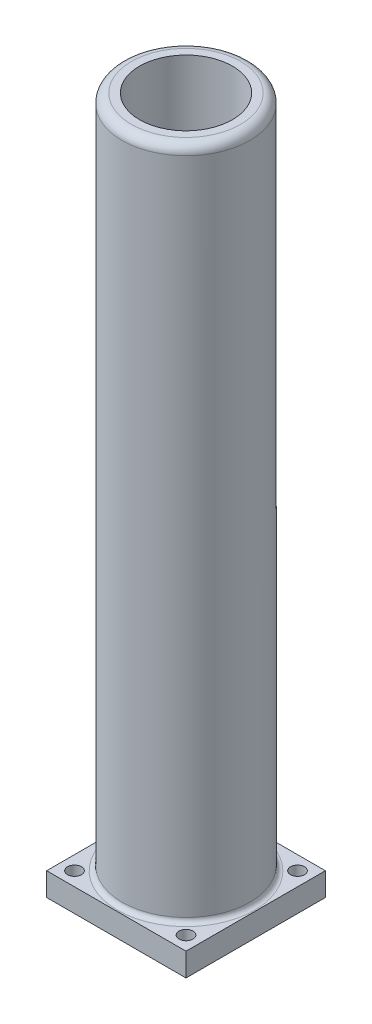
ISO-10303-21;
HEADER;
FILE_DESCRIPTION(('STEP AP214'),'2;1');
FILE_NAME('part.step','',(''),(''),'','','');
FILE_SCHEMA(('AUTOMOTIVE_DESIGN { 1 0 10303 214 1 1 1 1 }'));
ENDSEC;
DATA;
#1=APPLICATION_CONTEXT('core data for automotive mechanical design processes');
#2=APPLICATION_PROTOCOL_DEFINITION('international standard','automotive_design',2000,#1);
#3=PRODUCT_CONTEXT('',#1,'mechanical');
#4=PRODUCT('Part','Part','',(#3));
#5=PRODUCT_RELATED_PRODUCT_CATEGORY('part','',(#4));
#6=PRODUCT_DEFINITION_FORMATION('','',#4);
#7=PRODUCT_DEFINITION_CONTEXT('part definition',#1,'design');
#8=PRODUCT_DEFINITION('design','',#6,#7);
#9=PRODUCT_DEFINITION_SHAPE('','',#8);
#10=(LENGTH_UNIT() NAMED_UNIT(*) SI_UNIT(.MILLI.,.METRE.));
#11=(NAMED_UNIT(*) PLANE_ANGLE_UNIT() SI_UNIT($,.RADIAN.));
#12=(NAMED_UNIT(*) SI_UNIT($,.STERADIAN.) SOLID_ANGLE_UNIT());
#13=UNCERTAINTY_MEASURE_WITH_UNIT(LENGTH_MEASURE(1.E-05),#10,'distance_accuracy_value','');
#14=(GEOMETRIC_REPRESENTATION_CONTEXT(3) GLOBAL_UNCERTAINTY_ASSIGNED_CONTEXT((#13)) GLOBAL_UNIT_ASSIGNED_CONTEXT((#10,
#11,#12)) REPRESENTATION_CONTEXT('',''));
#15=CARTESIAN_POINT('',(0.,0.,0.));
#16=DIRECTION('',(0.,0.,1.));
#17=DIRECTION('',(1.,0.,0.));
#18=AXIS2_PLACEMENT_3D('',#15,#16,#17);
#19=CARTESIAN_POINT('',(30.,300.,30.));
#20=DIRECTION('',(-1.,0.,0.));
#21=DIRECTION('',(0.,0.,1.));
#22=AXIS2_PLACEMENT_3D('',#19,#20,#21);
#23=PLANE('',#22);
#24=DIRECTION('',(0.,0.,-1.));
#25=VECTOR('',#24,1.);
#26=CARTESIAN_POINT('',(30.,10.,30.));
#27=LINE('',#26,#25);
#28=CARTESIAN_POINT('',(30.,10.,30.));
#29=VERTEX_POINT('',#28);
#30=CARTESIAN_POINT('',(30.,10.,-30.));
#31=VERTEX_POINT('',#30);
#32=EDGE_CURVE('E81',#29,#31,#27,.T.);
#33=ORIENTED_EDGE('',*,*,#32,.F.);
#34=DIRECTION('',(0.,-1.,0.));
#35=VECTOR('',#34,1.);
#36=CARTESIAN_POINT('',(30.,300.,30.));
#37=LINE('',#36,#35);
#38=CARTESIAN_POINT('',(30.,0.,30.));
#39=VERTEX_POINT('',#38);
#40=EDGE_CURVE('E62',#29,#39,#37,.T.);
#41=ORIENTED_EDGE('',*,*,#40,.T.);
#42=DIRECTION('',(0.,0.,-1.));
#43=VECTOR('',#42,1.);
#44=CARTESIAN_POINT('',(30.,0.,30.));
#45=LINE('',#44,#43);
#46=CARTESIAN_POINT('',(30.,0.,-30.));
#47=VERTEX_POINT('',#46);
#48=EDGE_CURVE('E89',#39,#47,#45,.T.);
#49=ORIENTED_EDGE('',*,*,#48,.T.);
#50=DIRECTION('',(0.,-1.,0.));
#51=VECTOR('',#50,1.);
#52=CARTESIAN_POINT('',(30.,300.,-30.));
#53=LINE('',#52,#51);
#54=EDGE_CURVE('E86',#31,#47,#53,.T.);
#55=ORIENTED_EDGE('',*,*,#54,.F.);
#56=EDGE_LOOP('',(#33,#41,#49,#55));
#57=FACE_BOUND('',#56,.T.);
#58=ADVANCED_FACE('F39',(#57),#23,.F.);
#59=CARTESIAN_POINT('',(-30.,300.,-30.));
#60=DIRECTION('',(0.,0.,1.));
#61=DIRECTION('',(1.,0.,0.));
#62=AXIS2_PLACEMENT_3D('',#59,#60,#61);
#63=PLANE('',#62);
#64=DIRECTION('',(-1.,0.,0.));
#65=VECTOR('',#64,1.);
#66=CARTESIAN_POINT('',(-30.,10.,-30.));
#67=LINE('',#66,#65);
#68=CARTESIAN_POINT('',(-30.,10.,-30.));
#69=VERTEX_POINT('',#68);
#70=EDGE_CURVE('E90',#31,#69,#67,.T.);
#71=ORIENTED_EDGE('',*,*,#70,.F.);
#72=ORIENTED_EDGE('',*,*,#54,.T.);
#73=DIRECTION('',(-1.,0.,0.));
#74=VECTOR('',#73,1.);
#75=CARTESIAN_POINT('',(-30.,0.,-30.));
#76=LINE('',#75,#74);
#77=CARTESIAN_POINT('',(-30.,0.,-30.));
#78=VERTEX_POINT('',#77);
#79=EDGE_CURVE('E210',#47,#78,#76,.T.);
#80=ORIENTED_EDGE('',*,*,#79,.T.);
#81=DIRECTION('',(0.,-1.,0.));
#82=VECTOR('',#81,1.);
#83=CARTESIAN_POINT('',(-30.,300.,-30.));
#84=LINE('',#83,#82);
#85=EDGE_CURVE('E98',#69,#78,#84,.T.);
#86=ORIENTED_EDGE('',*,*,#85,.F.);
#87=EDGE_LOOP('',(#71,#72,#80,#86));
#88=FACE_BOUND('',#87,.T.);
#89=ADVANCED_FACE('F131',(#88),#63,.F.);
#90=CARTESIAN_POINT('',(-30.,300.,30.));
#91=DIRECTION('',(1.,0.,0.));
#92=DIRECTION('',(0.,0.,-1.));
#93=AXIS2_PLACEMENT_3D('',#90,#91,#92);
#94=PLANE('',#93);
#95=DIRECTION('',(0.,0.,1.));
#96=VECTOR('',#95,1.);
#97=CARTESIAN_POINT('',(-30.,10.,30.));
#98=LINE('',#97,#96);
#99=CARTESIAN_POINT('',(-30.,10.,30.));
#100=VERTEX_POINT('',#99);
#101=EDGE_CURVE('E54',#69,#100,#98,.T.);
#102=ORIENTED_EDGE('',*,*,#101,.F.);
#103=ORIENTED_EDGE('',*,*,#85,.T.);
#104=DIRECTION('',(0.,0.,1.));
#105=VECTOR('',#104,1.);
#106=CARTESIAN_POINT('',(-30.,0.,30.));
#107=LINE('',#106,#105);
#108=CARTESIAN_POINT('',(-30.,0.,30.));
#109=VERTEX_POINT('',#108);
#110=EDGE_CURVE('E100',#78,#109,#107,.T.);
#111=ORIENTED_EDGE('',*,*,#110,.T.);
#112=DIRECTION('',(0.,-1.,0.));
#113=VECTOR('',#112,1.);
#114=CARTESIAN_POINT('',(-30.,300.,30.));
#115=LINE('',#114,#113);
#116=EDGE_CURVE('E96',#100,#109,#115,.T.);
#117=ORIENTED_EDGE('',*,*,#116,.F.);
#118=EDGE_LOOP('',(#102,#103,#111,#117));
#119=FACE_BOUND('',#118,.T.);
#120=ADVANCED_FACE('F136',(#119),#94,.F.);
#121=CARTESIAN_POINT('',(-30.,300.,30.));
#122=DIRECTION('',(0.,0.,-1.));
#123=DIRECTION('',(-1.,0.,0.));
#124=AXIS2_PLACEMENT_3D('',#121,#122,#123);
#125=PLANE('',#124);
#126=DIRECTION('',(1.,0.,0.));
#127=VECTOR('',#126,1.);
#128=CARTESIAN_POINT('',(-30.,10.,30.));
#129=LINE('',#128,#127);
#130=EDGE_CURVE('E79',#100,#29,#129,.T.);
#131=ORIENTED_EDGE('',*,*,#130,.F.);
#132=ORIENTED_EDGE('',*,*,#116,.T.);
#133=DIRECTION('',(1.,0.,0.));
#134=VECTOR('',#133,1.);
#135=CARTESIAN_POINT('',(-30.,0.,30.));
#136=LINE('',#135,#134);
#137=EDGE_CURVE('E94',#109,#39,#136,.T.);
#138=ORIENTED_EDGE('',*,*,#137,.T.);
#139=ORIENTED_EDGE('',*,*,#40,.F.);
#140=EDGE_LOOP('',(#131,#132,#138,#139));
#141=FACE_BOUND('',#140,.T.);
#142=ADVANCED_FACE('F92',(#141),#125,.F.);
#143=CARTESIAN_POINT('',(0.,0.,0.));
#144=DIRECTION('',(0.,-1.,0.));
#145=DIRECTION('',(0.,0.,-1.));
#146=AXIS2_PLACEMENT_3D('',#143,#144,#145);
#147=PLANE('',#146);
#148=CARTESIAN_POINT('',(-24.,0.,24.));
#149=DIRECTION('',(0.,1.,0.));
#150=DIRECTION('',(0.,0.,1.));
#151=AXIS2_PLACEMENT_3D('',#148,#149,#150);
#152=CIRCLE('',#151,2.99999999999999);
#153=CARTESIAN_POINT('',(-24.,0.,27.));
#154=VERTEX_POINT('',#153);
#155=EDGE_CURVE('E176',#154,#154,#152,.T.);
#156=ORIENTED_EDGE('',*,*,#155,.T.);
#157=EDGE_LOOP('',(#156));
#158=FACE_BOUND('',#157,.T.);
#159=CARTESIAN_POINT('',(-24.,0.,-24.));
#160=DIRECTION('',(0.,1.,0.));
#161=DIRECTION('',(0.,0.,1.));
#162=AXIS2_PLACEMENT_3D('',#159,#160,#161);
#163=CIRCLE('',#162,2.99999999999999);
#164=CARTESIAN_POINT('',(-24.,0.,-21.));
#165=VERTEX_POINT('',#164);
#166=EDGE_CURVE('E186',#165,#165,#163,.T.);
#167=ORIENTED_EDGE('',*,*,#166,.T.);
#168=EDGE_LOOP('',(#167));
#169=FACE_BOUND('',#168,.T.);
#170=CARTESIAN_POINT('',(24.,0.,-24.));
#171=DIRECTION('',(0.,1.,0.));
#172=DIRECTION('',(0.,0.,1.));
#173=AXIS2_PLACEMENT_3D('',#170,#171,#172);
#174=CIRCLE('',#173,2.99999999999999);
#175=CARTESIAN_POINT('',(24.,0.,-21.));
#176=VERTEX_POINT('',#175);
#177=EDGE_CURVE('E192',#176,#176,#174,.T.);
#178=ORIENTED_EDGE('',*,*,#177,.T.);
#179=EDGE_LOOP('',(#178));
#180=FACE_BOUND('',#179,.T.);
#181=CARTESIAN_POINT('',(24.,0.,24.));
#182=DIRECTION('',(0.,1.,0.));
#183=DIRECTION('',(0.,0.,1.));
#184=AXIS2_PLACEMENT_3D('',#181,#182,#183);
#185=CIRCLE('',#184,2.99999999999999);
#186=CARTESIAN_POINT('',(24.,0.,27.));
#187=VERTEX_POINT('',#186);
#188=EDGE_CURVE('E198',#187,#187,#185,.T.);
#189=ORIENTED_EDGE('',*,*,#188,.T.);
#190=EDGE_LOOP('',(#189));
#191=FACE_BOUND('',#190,.T.);
#192=CARTESIAN_POINT('',(0.,0.,0.));
#193=DIRECTION('',(0.,1.,0.));
#194=DIRECTION('',(0.,0.,1.));
#195=AXIS2_PLACEMENT_3D('',#192,#193,#194);
#196=CIRCLE('',#195,20.);
#197=CARTESIAN_POINT('',(0.,0.,20.));
#198=VERTEX_POINT('',#197);
#199=EDGE_CURVE('E202',#198,#198,#196,.T.);
#200=ORIENTED_EDGE('',*,*,#199,.T.);
#201=EDGE_LOOP('',(#200));
#202=FACE_BOUND('',#201,.T.);
#203=ORIENTED_EDGE('',*,*,#48,.F.);
#204=ORIENTED_EDGE('',*,*,#137,.F.);
#205=ORIENTED_EDGE('',*,*,#110,.F.);
#206=ORIENTED_EDGE('',*,*,#79,.F.);
#207=EDGE_LOOP('',(#203,#204,#205,#206));
#208=FACE_BOUND('',#207,.T.);
#209=ADVANCED_FACE('F145',(#158,#169,#180,#191,#202,#208),#147,.T.);
#210=CARTESIAN_POINT('',(0.,10.,0.));
#211=DIRECTION('',(0.,1.,0.));
#212=DIRECTION('',(0.,0.,1.));
#213=AXIS2_PLACEMENT_3D('',#210,#211,#212);
#214=PLANE('',#213);
#215=CARTESIAN_POINT('',(-24.,10.,24.));
#216=DIRECTION('',(0.,1.,0.));
#217=DIRECTION('',(0.,0.,1.));
#218=AXIS2_PLACEMENT_3D('',#215,#216,#217);
#219=CIRCLE('',#218,2.99999999999999);
#220=CARTESIAN_POINT('',(-24.,10.,27.));
#221=VERTEX_POINT('',#220);
#222=EDGE_CURVE('E179',#221,#221,#219,.T.);
#223=ORIENTED_EDGE('',*,*,#222,.F.);
#224=EDGE_LOOP('',(#223));
#225=FACE_BOUND('',#224,.T.);
#226=CARTESIAN_POINT('',(-24.,10.,-24.));
#227=DIRECTION('',(0.,1.,0.));
#228=DIRECTION('',(0.,0.,1.));
#229=AXIS2_PLACEMENT_3D('',#226,#227,#228);
#230=CIRCLE('',#229,2.99999999999999);
#231=CARTESIAN_POINT('',(-24.,10.,-21.));
#232=VERTEX_POINT('',#231);
#233=EDGE_CURVE('E181',#232,#232,#230,.T.);
#234=ORIENTED_EDGE('',*,*,#233,.F.);
#235=EDGE_LOOP('',(#234));
#236=FACE_BOUND('',#235,.T.);
#237=CARTESIAN_POINT('',(24.,10.,-24.));
#238=DIRECTION('',(0.,1.,0.));
#239=DIRECTION('',(0.,0.,1.));
#240=AXIS2_PLACEMENT_3D('',#237,#238,#239);
#241=CIRCLE('',#240,2.99999999999999);
#242=CARTESIAN_POINT('',(24.,10.,-21.));
#243=VERTEX_POINT('',#242);
#244=EDGE_CURVE('E189',#243,#243,#241,.T.);
#245=ORIENTED_EDGE('',*,*,#244,.F.);
#246=EDGE_LOOP('',(#245));
#247=FACE_BOUND('',#246,.T.);
#248=CARTESIAN_POINT('',(24.,10.,24.));
#249=DIRECTION('',(0.,1.,0.));
#250=DIRECTION('',(0.,0.,1.));
#251=AXIS2_PLACEMENT_3D('',#248,#249,#250);
#252=CIRCLE('',#251,2.99999999999999);
#253=CARTESIAN_POINT('',(24.,10.,27.));
#254=VERTEX_POINT('',#253);
#255=EDGE_CURVE('E195',#254,#254,#252,.T.);
#256=ORIENTED_EDGE('',*,*,#255,.F.);
#257=EDGE_LOOP('',(#256));
#258=FACE_BOUND('',#257,.T.);
#259=CARTESIAN_POINT('',(0.,10.,0.));
#260=DIRECTION('',(0.,1.,0.));
#261=DIRECTION('',(0.,0.,1.));
#262=AXIS2_PLACEMENT_3D('',#259,#260,#261);
#263=CIRCLE('',#262,29.5);
#264=CARTESIAN_POINT('',(0.,10.,29.5));
#265=VERTEX_POINT('',#264);
#266=EDGE_CURVE('E108',#265,#265,#263,.F.);
#267=ORIENTED_EDGE('',*,*,#266,.T.);
#268=EDGE_LOOP('',(#267));
#269=FACE_BOUND('',#268,.T.);
#270=ORIENTED_EDGE('',*,*,#32,.T.);
#271=ORIENTED_EDGE('',*,*,#70,.T.);
#272=ORIENTED_EDGE('',*,*,#101,.T.);
#273=ORIENTED_EDGE('',*,*,#130,.T.);
#274=EDGE_LOOP('',(#270,#271,#272,#273));
#275=FACE_BOUND('',#274,.T.);
#276=ADVANCED_FACE('F80',(#225,#236,#247,#258,#269,#275),#214,.T.);
#277=CARTESIAN_POINT('',(0.,10.,0.));
#278=DIRECTION('',(0.,1.,0.));
#279=DIRECTION('',(0.,0.,1.));
#280=AXIS2_PLACEMENT_3D('',#277,#278,#279);
#281=CYLINDRICAL_SURFACE('',#280,27.5);
#282=CARTESIAN_POINT('',(0.,296.,0.));
#283=DIRECTION('',(0.,-1.,0.));
#284=DIRECTION('',(0.,0.,-1.));
#285=AXIS2_PLACEMENT_3D('',#282,#283,#284);
#286=CIRCLE('',#285,27.5);
#287=CARTESIAN_POINT('',(0.,296.,-27.5));
#288=VERTEX_POINT('',#287);
#289=EDGE_CURVE('E12',#288,#288,#286,.T.);
#290=ORIENTED_EDGE('',*,*,#289,.T.);
#291=EDGE_LOOP('',(#290));
#292=FACE_BOUND('',#291,.T.);
#293=CARTESIAN_POINT('',(0.,12.,0.));
#294=DIRECTION('',(0.,1.,0.));
#295=DIRECTION('',(0.,0.,1.));
#296=AXIS2_PLACEMENT_3D('',#293,#294,#295);
#297=CIRCLE('',#296,27.5);
#298=CARTESIAN_POINT('',(0.,12.,27.5));
#299=VERTEX_POINT('',#298);
#300=EDGE_CURVE('E85',#299,#299,#297,.T.);
#301=ORIENTED_EDGE('',*,*,#300,.T.);
#302=EDGE_LOOP('',(#301));
#303=FACE_BOUND('',#302,.T.);
#304=ADVANCED_FACE('F151',(#292,#303),#281,.T.);
#305=CARTESIAN_POINT('',(0.,300.,0.));
#306=DIRECTION('',(0.,-1.,0.));
#307=DIRECTION('',(0.,0.,-1.));
#308=AXIS2_PLACEMENT_3D('',#305,#306,#307);
#309=PLANE('',#308);
#310=CARTESIAN_POINT('',(0.,300.,0.));
#311=DIRECTION('',(0.,-1.,0.));
#312=DIRECTION('',(0.,0.,-1.));
#313=AXIS2_PLACEMENT_3D('',#310,#311,#312);
#314=CIRCLE('',#313,23.5);
#315=CARTESIAN_POINT('',(0.,300.,-23.5));
#316=VERTEX_POINT('',#315);
#317=EDGE_CURVE('E47',#316,#316,#314,.F.);
#318=ORIENTED_EDGE('',*,*,#317,.T.);
#319=EDGE_LOOP('',(#318));
#320=FACE_BOUND('',#319,.T.);
#321=CARTESIAN_POINT('',(0.,300.,0.));
#322=DIRECTION('',(0.,1.,0.));
#323=DIRECTION('',(0.,0.,1.));
#324=AXIS2_PLACEMENT_3D('',#321,#322,#323);
#325=CIRCLE('',#324,20.);
#326=CARTESIAN_POINT('',(0.,300.,20.));
#327=VERTEX_POINT('',#326);
#328=EDGE_CURVE('E201',#327,#327,#325,.T.);
#329=ORIENTED_EDGE('',*,*,#328,.F.);
#330=EDGE_LOOP('',(#329));
#331=FACE_BOUND('',#330,.T.);
#332=ADVANCED_FACE('F113',(#320,#331),#309,.F.);
#333=CARTESIAN_POINT('',(0.,0.,0.));
#334=DIRECTION('',(0.,1.,0.));
#335=DIRECTION('',(0.,0.,1.));
#336=AXIS2_PLACEMENT_3D('',#333,#334,#335);
#337=CYLINDRICAL_SURFACE('',#336,20.);
#338=ORIENTED_EDGE('',*,*,#199,.F.);
#339=EDGE_LOOP('',(#338));
#340=FACE_BOUND('',#339,.T.);
#341=ORIENTED_EDGE('',*,*,#328,.T.);
#342=EDGE_LOOP('',(#341));
#343=FACE_BOUND('',#342,.T.);
#344=ADVANCED_FACE('F127',(#340,#343),#337,.F.);
#345=CARTESIAN_POINT('',(0.,12.,0.));
#346=DIRECTION('',(0.,1.,0.));
#347=DIRECTION('',(0.,0.,1.));
#348=AXIS2_PLACEMENT_3D('',#345,#346,#347);
#349=TOROIDAL_SURFACE('',#348,29.5,2.);
#350=ORIENTED_EDGE('',*,*,#266,.F.);
#351=EDGE_LOOP('',(#350));
#352=FACE_BOUND('',#351,.T.);
#353=ORIENTED_EDGE('',*,*,#300,.F.);
#354=EDGE_LOOP('',(#353));
#355=FACE_BOUND('',#354,.T.);
#356=ADVANCED_FACE('F118',(#352,#355),#349,.F.);
#357=CARTESIAN_POINT('',(0.,296.,0.));
#358=DIRECTION('',(0.,-1.,0.));
#359=DIRECTION('',(0.,0.,-1.));
#360=AXIS2_PLACEMENT_3D('',#357,#358,#359);
#361=TOROIDAL_SURFACE('',#360,23.5,4.);
#362=ORIENTED_EDGE('',*,*,#289,.F.);
#363=EDGE_LOOP('',(#362));
#364=FACE_BOUND('',#363,.T.);
#365=ORIENTED_EDGE('',*,*,#317,.F.);
#366=EDGE_LOOP('',(#365));
#367=FACE_BOUND('',#366,.T.);
#368=ADVANCED_FACE('F41',(#364,#367),#361,.T.);
#369=CARTESIAN_POINT('',(24.,10.,24.));
#370=DIRECTION('',(0.,1.,0.));
#371=DIRECTION('',(0.,0.,1.));
#372=AXIS2_PLACEMENT_3D('',#369,#370,#371);
#373=CYLINDRICAL_SURFACE('',#372,2.99999999999999);
#374=ORIENTED_EDGE('',*,*,#188,.F.);
#375=EDGE_LOOP('',(#374));
#376=FACE_BOUND('',#375,.T.);
#377=ORIENTED_EDGE('',*,*,#255,.T.);
#378=EDGE_LOOP('',(#377));
#379=FACE_BOUND('',#378,.T.);
#380=ADVANCED_FACE('F117',(#376,#379),#373,.F.);
#381=CARTESIAN_POINT('',(24.,10.,-24.));
#382=DIRECTION('',(0.,1.,0.));
#383=DIRECTION('',(0.,0.,1.));
#384=AXIS2_PLACEMENT_3D('',#381,#382,#383);
#385=CYLINDRICAL_SURFACE('',#384,2.99999999999999);
#386=ORIENTED_EDGE('',*,*,#177,.F.);
#387=EDGE_LOOP('',(#386));
#388=FACE_BOUND('',#387,.T.);
#389=ORIENTED_EDGE('',*,*,#244,.T.);
#390=EDGE_LOOP('',(#389));
#391=FACE_BOUND('',#390,.T.);
#392=ADVANCED_FACE('F124',(#388,#391),#385,.F.);
#393=CARTESIAN_POINT('',(-24.,10.,-24.));
#394=DIRECTION('',(0.,1.,0.));
#395=DIRECTION('',(0.,0.,1.));
#396=AXIS2_PLACEMENT_3D('',#393,#394,#395);
#397=CYLINDRICAL_SURFACE('',#396,2.99999999999999);
#398=ORIENTED_EDGE('',*,*,#166,.F.);
#399=EDGE_LOOP('',(#398));
#400=FACE_BOUND('',#399,.T.);
#401=ORIENTED_EDGE('',*,*,#233,.T.);
#402=EDGE_LOOP('',(#401));
#403=FACE_BOUND('',#402,.T.);
#404=ADVANCED_FACE('F163',(#400,#403),#397,.F.);
#405=CARTESIAN_POINT('',(-24.,10.,24.));
#406=DIRECTION('',(0.,1.,0.));
#407=DIRECTION('',(0.,0.,1.));
#408=AXIS2_PLACEMENT_3D('',#405,#406,#407);
#409=CYLINDRICAL_SURFACE('',#408,2.99999999999999);
#410=ORIENTED_EDGE('',*,*,#155,.F.);
#411=EDGE_LOOP('',(#410));
#412=FACE_BOUND('',#411,.T.);
#413=ORIENTED_EDGE('',*,*,#222,.T.);
#414=EDGE_LOOP('',(#413));
#415=FACE_BOUND('',#414,.T.);
#416=ADVANCED_FACE('F167',(#412,#415),#409,.F.);
#417=CLOSED_SHELL('',(#58,#89,#120,#142,#209,#276,#304,#332,#344,#356,#368,#380,#392,#404,#416));
#418=MANIFOLD_SOLID_BREP('B2',#417);
#419=ADVANCED_BREP_SHAPE_REPRESENTATION('',(#18,#418),#14);
#420=SHAPE_DEFINITION_REPRESENTATION(#9,#419);
ENDSEC;
END-ISO-10303-21;
